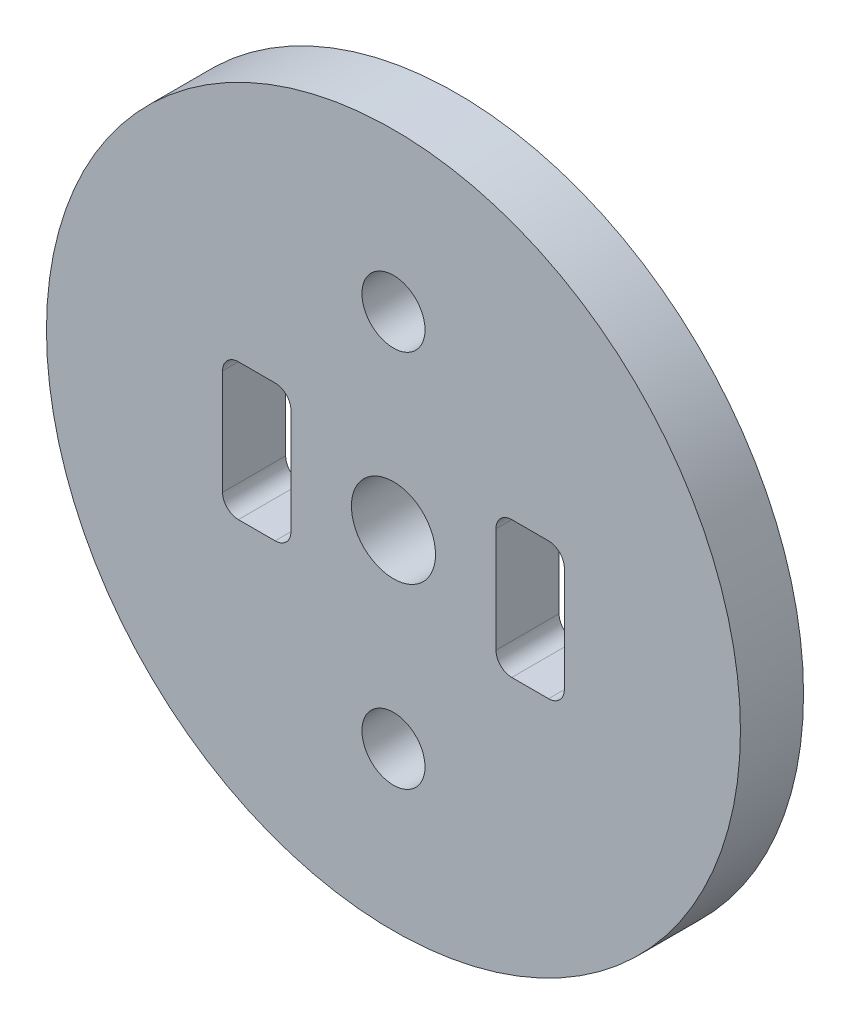
ISO-10303-21;
HEADER;
FILE_DESCRIPTION(('STEP AP214'),'2;1');
FILE_NAME('part.step','',(''),(''),'','','');
FILE_SCHEMA(('AUTOMOTIVE_DESIGN { 1 0 10303 214 1 1 1 1 }'));
ENDSEC;
DATA;
#1=APPLICATION_CONTEXT('core data for automotive mechanical design processes');
#2=APPLICATION_PROTOCOL_DEFINITION('international standard','automotive_design',2000,#1);
#3=PRODUCT_CONTEXT('',#1,'mechanical');
#4=PRODUCT('Part','Part','',(#3));
#5=PRODUCT_RELATED_PRODUCT_CATEGORY('part','',(#4));
#6=PRODUCT_DEFINITION_FORMATION('','',#4);
#7=PRODUCT_DEFINITION_CONTEXT('part definition',#1,'design');
#8=PRODUCT_DEFINITION('design','',#6,#7);
#9=PRODUCT_DEFINITION_SHAPE('','',#8);
#10=(LENGTH_UNIT() NAMED_UNIT(*) SI_UNIT(.MILLI.,.METRE.));
#11=(NAMED_UNIT(*) PLANE_ANGLE_UNIT() SI_UNIT($,.RADIAN.));
#12=(NAMED_UNIT(*) SI_UNIT($,.STERADIAN.) SOLID_ANGLE_UNIT());
#13=UNCERTAINTY_MEASURE_WITH_UNIT(LENGTH_MEASURE(1.E-05),#10,'distance_accuracy_value','');
#14=(GEOMETRIC_REPRESENTATION_CONTEXT(3) GLOBAL_UNCERTAINTY_ASSIGNED_CONTEXT((#13)) GLOBAL_UNIT_ASSIGNED_CONTEXT((#10,
#11,#12)) REPRESENTATION_CONTEXT('',''));
#15=CARTESIAN_POINT('',(0.,0.,0.));
#16=DIRECTION('',(0.,0.,1.));
#17=DIRECTION('',(1.,0.,0.));
#18=AXIS2_PLACEMENT_3D('',#15,#16,#17);
#19=CARTESIAN_POINT('',(215.7478079135,241.9520199932,3.));
#20=DIRECTION('',(0.,0.,1.));
#21=DIRECTION('',(1.,0.,0.));
#22=AXIS2_PLACEMENT_3D('',#19,#20,#21);
#23=PLANE('',#22);
#24=DIRECTION('',(0.,-1.,0.));
#25=VECTOR('',#24,1.);
#26=CARTESIAN_POINT('',(220.6228079135,244.4520199932,3.));
#27=LINE('',#26,#25);
#28=CARTESIAN_POINT('',(220.6228079135,244.4520199932,3.));
#29=VERTEX_POINT('',#28);
#30=CARTESIAN_POINT('',(220.6228079135,239.4520199932,3.));
#31=VERTEX_POINT('',#30);
#32=EDGE_CURVE('E213',#29,#31,#27,.T.);
#33=ORIENTED_EDGE('',*,*,#32,.F.);
#34=CARTESIAN_POINT('',(221.3728079135,244.4520199932,3.));
#35=DIRECTION('',(0.,0.,1.));
#36=DIRECTION('',(1.,0.,0.));
#37=AXIS2_PLACEMENT_3D('',#34,#35,#36);
#38=CIRCLE('',#37,0.750000000000001);
#39=CARTESIAN_POINT('',(221.3728079135,245.2020199932,3.));
#40=VERTEX_POINT('',#39);
#41=EDGE_CURVE('E211',#40,#29,#38,.T.);
#42=ORIENTED_EDGE('',*,*,#41,.F.);
#43=DIRECTION('',(-1.,0.,0.));
#44=VECTOR('',#43,1.);
#45=CARTESIAN_POINT('',(223.1228079135,245.2020199932,3.));
#46=LINE('',#45,#44);
#47=CARTESIAN_POINT('',(223.1228079135,245.2020199932,3.));
#48=VERTEX_POINT('',#47);
#49=EDGE_CURVE('E227',#48,#40,#46,.T.);
#50=ORIENTED_EDGE('',*,*,#49,.F.);
#51=CARTESIAN_POINT('',(223.1228079135,244.4520199932,3.));
#52=DIRECTION('',(0.,0.,1.));
#53=DIRECTION('',(1.,0.,0.));
#54=AXIS2_PLACEMENT_3D('',#51,#52,#53);
#55=CIRCLE('',#54,0.750000000000001);
#56=CARTESIAN_POINT('',(223.8728079135,244.4520199932,3.));
#57=VERTEX_POINT('',#56);
#58=EDGE_CURVE('E224',#57,#48,#55,.T.);
#59=ORIENTED_EDGE('',*,*,#58,.F.);
#60=DIRECTION('',(0.,1.,0.));
#61=VECTOR('',#60,1.);
#62=CARTESIAN_POINT('',(223.8728079135,239.4520199932,3.));
#63=LINE('',#62,#61);
#64=CARTESIAN_POINT('',(223.8728079135,239.4520199932,3.));
#65=VERTEX_POINT('',#64);
#66=EDGE_CURVE('E222',#65,#57,#63,.T.);
#67=ORIENTED_EDGE('',*,*,#66,.F.);
#68=CARTESIAN_POINT('',(223.1228079135,239.4520199932,3.));
#69=DIRECTION('',(0.,0.,1.));
#70=DIRECTION('',(1.,0.,0.));
#71=AXIS2_PLACEMENT_3D('',#68,#69,#70);
#72=CIRCLE('',#71,0.750000000000001);
#73=CARTESIAN_POINT('',(223.1228079135,238.7020199932,3.));
#74=VERTEX_POINT('',#73);
#75=EDGE_CURVE('E220',#74,#65,#72,.T.);
#76=ORIENTED_EDGE('',*,*,#75,.F.);
#77=DIRECTION('',(1.,0.,0.));
#78=VECTOR('',#77,1.);
#79=CARTESIAN_POINT('',(221.3728079135,238.7020199932,3.));
#80=LINE('',#79,#78);
#81=CARTESIAN_POINT('',(221.3728079135,238.7020199932,3.));
#82=VERTEX_POINT('',#81);
#83=EDGE_CURVE('E218',#82,#74,#80,.T.);
#84=ORIENTED_EDGE('',*,*,#83,.F.);
#85=CARTESIAN_POINT('',(221.3728079135,239.4520199932,3.));
#86=DIRECTION('',(0.,0.,1.));
#87=DIRECTION('',(1.,0.,0.));
#88=AXIS2_PLACEMENT_3D('',#85,#86,#87);
#89=CIRCLE('',#88,0.750000000000001);
#90=EDGE_CURVE('E216',#31,#82,#89,.T.);
#91=ORIENTED_EDGE('',*,*,#90,.F.);
#92=EDGE_LOOP('',(#33,#42,#50,#59,#67,#76,#84,#91));
#93=FACE_BOUND('',#92,.T.);
#94=CARTESIAN_POINT('',(215.7478079135,232.9520199932,3.));
#95=DIRECTION('',(0.,0.,1.));
#96=DIRECTION('',(1.,0.,0.));
#97=AXIS2_PLACEMENT_3D('',#94,#95,#96);
#98=CIRCLE('',#97,1.5);
#99=CARTESIAN_POINT('',(217.2478079135,232.9520199932,3.));
#100=VERTEX_POINT('',#99);
#101=EDGE_CURVE('E276',#100,#100,#98,.T.);
#102=ORIENTED_EDGE('',*,*,#101,.F.);
#103=EDGE_LOOP('',(#102));
#104=FACE_BOUND('',#103,.T.);
#105=CARTESIAN_POINT('',(215.7478079135,241.9520199932,3.));
#106=DIRECTION('',(0.,0.,1.));
#107=DIRECTION('',(1.,0.,0.));
#108=AXIS2_PLACEMENT_3D('',#105,#106,#107);
#109=CIRCLE('',#108,16.5);
#110=CARTESIAN_POINT('',(232.2478079135,241.9520199932,3.));
#111=VERTEX_POINT('',#110);
#112=EDGE_CURVE('E11',#111,#111,#109,.T.);
#113=ORIENTED_EDGE('',*,*,#112,.T.);
#114=EDGE_LOOP('',(#113));
#115=FACE_BOUND('',#114,.T.);
#116=CARTESIAN_POINT('',(215.7478079135,241.9520199932,3.));
#117=DIRECTION('',(0.,0.,1.));
#118=DIRECTION('',(1.,0.,0.));
#119=AXIS2_PLACEMENT_3D('',#116,#117,#118);
#120=CIRCLE('',#119,2.);
#121=CARTESIAN_POINT('',(217.7478079135,241.9520199932,3.));
#122=VERTEX_POINT('',#121);
#123=EDGE_CURVE('E282',#122,#122,#120,.T.);
#124=ORIENTED_EDGE('',*,*,#123,.F.);
#125=EDGE_LOOP('',(#124));
#126=FACE_BOUND('',#125,.T.);
#127=CARTESIAN_POINT('',(215.7478079135,250.9520199932,3.));
#128=DIRECTION('',(0.,0.,1.));
#129=DIRECTION('',(1.,0.,0.));
#130=AXIS2_PLACEMENT_3D('',#127,#128,#129);
#131=CIRCLE('',#130,1.5);
#132=CARTESIAN_POINT('',(217.2478079135,250.9520199932,3.));
#133=VERTEX_POINT('',#132);
#134=EDGE_CURVE('E270',#133,#133,#131,.T.);
#135=ORIENTED_EDGE('',*,*,#134,.F.);
#136=EDGE_LOOP('',(#135));
#137=FACE_BOUND('',#136,.T.);
#138=DIRECTION('',(-1.,0.,0.));
#139=VECTOR('',#138,1.);
#140=CARTESIAN_POINT('',(208.3728079135,245.2020199932,3.));
#141=LINE('',#140,#139);
#142=CARTESIAN_POINT('',(210.1228079135,245.2020199932,3.));
#143=VERTEX_POINT('',#142);
#144=CARTESIAN_POINT('',(208.3728079135,245.2020199932,3.));
#145=VERTEX_POINT('',#144);
#146=EDGE_CURVE('E154',#143,#145,#141,.T.);
#147=ORIENTED_EDGE('',*,*,#146,.F.);
#148=CARTESIAN_POINT('',(210.1228079135,244.4520199932,3.));
#149=DIRECTION('',(0.,0.,1.));
#150=DIRECTION('',(1.,0.,0.));
#151=AXIS2_PLACEMENT_3D('',#148,#149,#150);
#152=CIRCLE('',#151,0.750000000000001);
#153=CARTESIAN_POINT('',(210.8728079135,244.4520199932,3.));
#154=VERTEX_POINT('',#153);
#155=EDGE_CURVE('E146',#154,#143,#152,.T.);
#156=ORIENTED_EDGE('',*,*,#155,.F.);
#157=DIRECTION('',(0.,1.,0.));
#158=VECTOR('',#157,1.);
#159=CARTESIAN_POINT('',(210.8728079135,244.4520199932,3.));
#160=LINE('',#159,#158);
#161=CARTESIAN_POINT('',(210.8728079135,239.4520199932,3.));
#162=VERTEX_POINT('',#161);
#163=EDGE_CURVE('E179',#162,#154,#160,.T.);
#164=ORIENTED_EDGE('',*,*,#163,.F.);
#165=CARTESIAN_POINT('',(210.1228079135,239.4520199932,3.));
#166=DIRECTION('',(0.,0.,1.));
#167=DIRECTION('',(1.,0.,0.));
#168=AXIS2_PLACEMENT_3D('',#165,#166,#167);
#169=CIRCLE('',#168,0.750000000000001);
#170=CARTESIAN_POINT('',(210.1228079135,238.7020199932,3.));
#171=VERTEX_POINT('',#170);
#172=EDGE_CURVE('E177',#171,#162,#169,.T.);
#173=ORIENTED_EDGE('',*,*,#172,.F.);
#174=DIRECTION('',(1.,0.,0.));
#175=VECTOR('',#174,1.);
#176=CARTESIAN_POINT('',(210.1228079135,238.7020199932,3.));
#177=LINE('',#176,#175);
#178=CARTESIAN_POINT('',(208.3728079135,238.7020199932,3.));
#179=VERTEX_POINT('',#178);
#180=EDGE_CURVE('E175',#179,#171,#177,.T.);
#181=ORIENTED_EDGE('',*,*,#180,.F.);
#182=CARTESIAN_POINT('',(208.3728079135,239.4520199932,3.));
#183=DIRECTION('',(0.,0.,1.));
#184=DIRECTION('',(1.,0.,0.));
#185=AXIS2_PLACEMENT_3D('',#182,#183,#184);
#186=CIRCLE('',#185,0.750000000000237);
#187=CARTESIAN_POINT('',(207.6228079135,239.4520199932,3.));
#188=VERTEX_POINT('',#187);
#189=EDGE_CURVE('E173',#188,#179,#186,.T.);
#190=ORIENTED_EDGE('',*,*,#189,.F.);
#191=DIRECTION('',(0.,-1.,0.));
#192=VECTOR('',#191,1.);
#193=CARTESIAN_POINT('',(207.6228079135,239.4520199932,3.));
#194=LINE('',#193,#192);
#195=CARTESIAN_POINT('',(207.6228079135,244.4520199932,3.));
#196=VERTEX_POINT('',#195);
#197=EDGE_CURVE('E169',#196,#188,#194,.T.);
#198=ORIENTED_EDGE('',*,*,#197,.F.);
#199=CARTESIAN_POINT('',(208.3728079135,244.4520199932,3.));
#200=DIRECTION('',(0.,0.,1.));
#201=DIRECTION('',(1.,0.,0.));
#202=AXIS2_PLACEMENT_3D('',#199,#200,#201);
#203=CIRCLE('',#202,0.750000000000001);
#204=EDGE_CURVE('E167',#145,#196,#203,.T.);
#205=ORIENTED_EDGE('',*,*,#204,.F.);
#206=EDGE_LOOP('',(#147,#156,#164,#173,#181,#190,#198,#205));
#207=FACE_BOUND('',#206,.T.);
#208=ADVANCED_FACE('F33',(#93,#104,#115,#126,#137,#207),#23,.T.);
#209=CARTESIAN_POINT('',(215.7478079135,241.9520199932,0.));
#210=DIRECTION('',(0.,0.,1.));
#211=DIRECTION('',(1.,0.,0.));
#212=AXIS2_PLACEMENT_3D('',#209,#210,#211);
#213=PLANE('',#212);
#214=CARTESIAN_POINT('',(221.3728079135,244.4520199932,0.));
#215=DIRECTION('',(0.,0.,1.));
#216=DIRECTION('',(1.,0.,0.));
#217=AXIS2_PLACEMENT_3D('',#214,#215,#216);
#218=CIRCLE('',#217,0.750000000000001);
#219=CARTESIAN_POINT('',(221.3728079135,245.2020199932,0.));
#220=VERTEX_POINT('',#219);
#221=CARTESIAN_POINT('',(220.6228079135,244.4520199932,0.));
#222=VERTEX_POINT('',#221);
#223=EDGE_CURVE('E162',#220,#222,#218,.T.);
#224=ORIENTED_EDGE('',*,*,#223,.T.);
#225=DIRECTION('',(0.,-1.,0.));
#226=VECTOR('',#225,1.);
#227=CARTESIAN_POINT('',(220.6228079135,244.4520199932,0.));
#228=LINE('',#227,#226);
#229=CARTESIAN_POINT('',(220.6228079135,239.4520199932,0.));
#230=VERTEX_POINT('',#229);
#231=EDGE_CURVE('E232',#222,#230,#228,.T.);
#232=ORIENTED_EDGE('',*,*,#231,.T.);
#233=CARTESIAN_POINT('',(221.3728079135,239.4520199932,0.));
#234=DIRECTION('',(0.,0.,1.));
#235=DIRECTION('',(1.,0.,0.));
#236=AXIS2_PLACEMENT_3D('',#233,#234,#235);
#237=CIRCLE('',#236,0.750000000000001);
#238=CARTESIAN_POINT('',(221.3728079135,238.7020199932,0.));
#239=VERTEX_POINT('',#238);
#240=EDGE_CURVE('E235',#230,#239,#237,.T.);
#241=ORIENTED_EDGE('',*,*,#240,.T.);
#242=DIRECTION('',(1.,0.,0.));
#243=VECTOR('',#242,1.);
#244=CARTESIAN_POINT('',(221.3728079135,238.7020199932,0.));
#245=LINE('',#244,#243);
#246=CARTESIAN_POINT('',(223.1228079135,238.7020199932,0.));
#247=VERTEX_POINT('',#246);
#248=EDGE_CURVE('E238',#239,#247,#245,.T.);
#249=ORIENTED_EDGE('',*,*,#248,.T.);
#250=CARTESIAN_POINT('',(223.1228079135,239.4520199932,0.));
#251=DIRECTION('',(0.,0.,1.));
#252=DIRECTION('',(1.,0.,0.));
#253=AXIS2_PLACEMENT_3D('',#250,#251,#252);
#254=CIRCLE('',#253,0.750000000000001);
#255=CARTESIAN_POINT('',(223.8728079135,239.4520199932,0.));
#256=VERTEX_POINT('',#255);
#257=EDGE_CURVE('E241',#247,#256,#254,.T.);
#258=ORIENTED_EDGE('',*,*,#257,.T.);
#259=DIRECTION('',(0.,1.,0.));
#260=VECTOR('',#259,1.);
#261=CARTESIAN_POINT('',(223.8728079135,239.4520199932,0.));
#262=LINE('',#261,#260);
#263=CARTESIAN_POINT('',(223.8728079135,244.4520199932,0.));
#264=VERTEX_POINT('',#263);
#265=EDGE_CURVE('E244',#256,#264,#262,.T.);
#266=ORIENTED_EDGE('',*,*,#265,.T.);
#267=CARTESIAN_POINT('',(223.1228079135,244.4520199932,0.));
#268=DIRECTION('',(0.,0.,1.));
#269=DIRECTION('',(1.,0.,0.));
#270=AXIS2_PLACEMENT_3D('',#267,#268,#269);
#271=CIRCLE('',#270,0.750000000000001);
#272=CARTESIAN_POINT('',(223.1228079135,245.2020199932,0.));
#273=VERTEX_POINT('',#272);
#274=EDGE_CURVE('E247',#264,#273,#271,.T.);
#275=ORIENTED_EDGE('',*,*,#274,.T.);
#276=DIRECTION('',(-1.,0.,0.));
#277=VECTOR('',#276,1.);
#278=CARTESIAN_POINT('',(223.1228079135,245.2020199932,0.));
#279=LINE('',#278,#277);
#280=EDGE_CURVE('E214',#273,#220,#279,.T.);
#281=ORIENTED_EDGE('',*,*,#280,.T.);
#282=EDGE_LOOP('',(#224,#232,#241,#249,#258,#266,#275,#281));
#283=FACE_BOUND('',#282,.T.);
#284=CARTESIAN_POINT('',(215.7478079135,232.9520199932,0.));
#285=DIRECTION('',(0.,0.,1.));
#286=DIRECTION('',(1.,0.,0.));
#287=AXIS2_PLACEMENT_3D('',#284,#285,#286);
#288=CIRCLE('',#287,1.5);
#289=CARTESIAN_POINT('',(217.2478079135,232.9520199932,0.));
#290=VERTEX_POINT('',#289);
#291=EDGE_CURVE('E273',#290,#290,#288,.T.);
#292=ORIENTED_EDGE('',*,*,#291,.T.);
#293=EDGE_LOOP('',(#292));
#294=FACE_BOUND('',#293,.T.);
#295=CARTESIAN_POINT('',(215.7478079135,241.9520199932,0.));
#296=DIRECTION('',(0.,0.,1.));
#297=DIRECTION('',(1.,0.,0.));
#298=AXIS2_PLACEMENT_3D('',#295,#296,#297);
#299=CIRCLE('',#298,16.5);
#300=CARTESIAN_POINT('',(232.2478079135,241.9520199932,0.));
#301=VERTEX_POINT('',#300);
#302=EDGE_CURVE('E37',#301,#301,#299,.T.);
#303=ORIENTED_EDGE('',*,*,#302,.F.);
#304=EDGE_LOOP('',(#303));
#305=FACE_BOUND('',#304,.T.);
#306=CARTESIAN_POINT('',(215.7478079135,241.9520199932,0.));
#307=DIRECTION('',(0.,0.,1.));
#308=DIRECTION('',(1.,0.,0.));
#309=AXIS2_PLACEMENT_3D('',#306,#307,#308);
#310=CIRCLE('',#309,2.);
#311=CARTESIAN_POINT('',(217.7478079135,241.9520199932,0.));
#312=VERTEX_POINT('',#311);
#313=EDGE_CURVE('E279',#312,#312,#310,.T.);
#314=ORIENTED_EDGE('',*,*,#313,.T.);
#315=EDGE_LOOP('',(#314));
#316=FACE_BOUND('',#315,.T.);
#317=CARTESIAN_POINT('',(215.7478079135,250.9520199932,0.));
#318=DIRECTION('',(0.,0.,1.));
#319=DIRECTION('',(1.,0.,0.));
#320=AXIS2_PLACEMENT_3D('',#317,#318,#319);
#321=CIRCLE('',#320,1.5);
#322=CARTESIAN_POINT('',(217.2478079135,250.9520199932,0.));
#323=VERTEX_POINT('',#322);
#324=EDGE_CURVE('E269',#323,#323,#321,.T.);
#325=ORIENTED_EDGE('',*,*,#324,.T.);
#326=EDGE_LOOP('',(#325));
#327=FACE_BOUND('',#326,.T.);
#328=CARTESIAN_POINT('',(210.1228079135,244.4520199932,0.));
#329=DIRECTION('',(0.,0.,1.));
#330=DIRECTION('',(1.,0.,0.));
#331=AXIS2_PLACEMENT_3D('',#328,#329,#330);
#332=CIRCLE('',#331,0.750000000000001);
#333=CARTESIAN_POINT('',(210.8728079135,244.4520199932,0.));
#334=VERTEX_POINT('',#333);
#335=CARTESIAN_POINT('',(210.1228079135,245.2020199932,0.));
#336=VERTEX_POINT('',#335);
#337=EDGE_CURVE('E56',#334,#336,#332,.T.);
#338=ORIENTED_EDGE('',*,*,#337,.T.);
#339=DIRECTION('',(-1.,0.,0.));
#340=VECTOR('',#339,1.);
#341=CARTESIAN_POINT('',(208.3728079135,245.2020199932,0.));
#342=LINE('',#341,#340);
#343=CARTESIAN_POINT('',(208.3728079135,245.2020199932,0.));
#344=VERTEX_POINT('',#343);
#345=EDGE_CURVE('E161',#336,#344,#342,.T.);
#346=ORIENTED_EDGE('',*,*,#345,.T.);
#347=CARTESIAN_POINT('',(208.3728079135,244.4520199932,0.));
#348=DIRECTION('',(0.,0.,1.));
#349=DIRECTION('',(1.,0.,0.));
#350=AXIS2_PLACEMENT_3D('',#347,#348,#349);
#351=CIRCLE('',#350,0.750000000000001);
#352=CARTESIAN_POINT('',(207.6228079135,244.4520199932,0.));
#353=VERTEX_POINT('',#352);
#354=EDGE_CURVE('E183',#344,#353,#351,.T.);
#355=ORIENTED_EDGE('',*,*,#354,.T.);
#356=DIRECTION('',(0.,-1.,0.));
#357=VECTOR('',#356,1.);
#358=CARTESIAN_POINT('',(207.6228079135,239.4520199932,0.));
#359=LINE('',#358,#357);
#360=CARTESIAN_POINT('',(207.6228079135,239.4520199932,0.));
#361=VERTEX_POINT('',#360);
#362=EDGE_CURVE('E186',#353,#361,#359,.T.);
#363=ORIENTED_EDGE('',*,*,#362,.T.);
#364=CARTESIAN_POINT('',(208.3728079135,239.4520199932,0.));
#365=DIRECTION('',(0.,0.,1.));
#366=DIRECTION('',(1.,0.,0.));
#367=AXIS2_PLACEMENT_3D('',#364,#365,#366);
#368=CIRCLE('',#367,0.750000000000237);
#369=CARTESIAN_POINT('',(208.3728079135,238.7020199932,0.));
#370=VERTEX_POINT('',#369);
#371=EDGE_CURVE('E189',#361,#370,#368,.T.);
#372=ORIENTED_EDGE('',*,*,#371,.T.);
#373=DIRECTION('',(1.,0.,0.));
#374=VECTOR('',#373,1.);
#375=CARTESIAN_POINT('',(210.1228079135,238.7020199932,0.));
#376=LINE('',#375,#374);
#377=CARTESIAN_POINT('',(210.1228079135,238.7020199932,0.));
#378=VERTEX_POINT('',#377);
#379=EDGE_CURVE('E192',#370,#378,#376,.T.);
#380=ORIENTED_EDGE('',*,*,#379,.T.);
#381=CARTESIAN_POINT('',(210.1228079135,239.4520199932,0.));
#382=DIRECTION('',(0.,0.,1.));
#383=DIRECTION('',(1.,0.,0.));
#384=AXIS2_PLACEMENT_3D('',#381,#382,#383);
#385=CIRCLE('',#384,0.750000000000001);
#386=CARTESIAN_POINT('',(210.8728079135,239.4520199932,0.));
#387=VERTEX_POINT('',#386);
#388=EDGE_CURVE('E195',#378,#387,#385,.T.);
#389=ORIENTED_EDGE('',*,*,#388,.T.);
#390=DIRECTION('',(0.,1.,0.));
#391=VECTOR('',#390,1.);
#392=CARTESIAN_POINT('',(210.8728079135,244.4520199932,0.));
#393=LINE('',#392,#391);
#394=EDGE_CURVE('E155',#387,#334,#393,.T.);
#395=ORIENTED_EDGE('',*,*,#394,.T.);
#396=EDGE_LOOP('',(#338,#346,#355,#363,#372,#380,#389,#395));
#397=FACE_BOUND('',#396,.T.);
#398=ADVANCED_FACE('F288',(#283,#294,#305,#316,#327,#397),#213,.F.);
#399=CARTESIAN_POINT('',(215.7478079135,241.9520199932,3.));
#400=DIRECTION('',(0.,0.,-1.));
#401=DIRECTION('',(-1.,0.,0.));
#402=AXIS2_PLACEMENT_3D('',#399,#400,#401);
#403=CYLINDRICAL_SURFACE('',#402,16.5);
#404=ORIENTED_EDGE('',*,*,#112,.F.);
#405=EDGE_LOOP('',(#404));
#406=FACE_BOUND('',#405,.T.);
#407=ORIENTED_EDGE('',*,*,#302,.T.);
#408=EDGE_LOOP('',(#407));
#409=FACE_BOUND('',#408,.T.);
#410=ADVANCED_FACE('F35',(#406,#409),#403,.T.);
#411=CARTESIAN_POINT('',(215.7478079135,241.9520199932,3.));
#412=DIRECTION('',(0.,0.,-1.));
#413=DIRECTION('',(-1.,0.,0.));
#414=AXIS2_PLACEMENT_3D('',#411,#412,#413);
#415=CYLINDRICAL_SURFACE('',#414,2.);
#416=ORIENTED_EDGE('',*,*,#123,.T.);
#417=EDGE_LOOP('',(#416));
#418=FACE_BOUND('',#417,.T.);
#419=ORIENTED_EDGE('',*,*,#313,.F.);
#420=EDGE_LOOP('',(#419));
#421=FACE_BOUND('',#420,.T.);
#422=ADVANCED_FACE('F291',(#418,#421),#415,.F.);
#423=CARTESIAN_POINT('',(215.7478079135,232.9520199932,3.));
#424=DIRECTION('',(0.,0.,-1.));
#425=DIRECTION('',(-1.,0.,0.));
#426=AXIS2_PLACEMENT_3D('',#423,#424,#425);
#427=CYLINDRICAL_SURFACE('',#426,1.5);
#428=ORIENTED_EDGE('',*,*,#101,.T.);
#429=EDGE_LOOP('',(#428));
#430=FACE_BOUND('',#429,.T.);
#431=ORIENTED_EDGE('',*,*,#291,.F.);
#432=EDGE_LOOP('',(#431));
#433=FACE_BOUND('',#432,.T.);
#434=ADVANCED_FACE('F293',(#430,#433),#427,.F.);
#435=CARTESIAN_POINT('',(215.7478079135,250.9520199932,3.));
#436=DIRECTION('',(0.,0.,-1.));
#437=DIRECTION('',(-1.,0.,0.));
#438=AXIS2_PLACEMENT_3D('',#435,#436,#437);
#439=CYLINDRICAL_SURFACE('',#438,1.5);
#440=ORIENTED_EDGE('',*,*,#134,.T.);
#441=EDGE_LOOP('',(#440));
#442=FACE_BOUND('',#441,.T.);
#443=ORIENTED_EDGE('',*,*,#324,.F.);
#444=EDGE_LOOP('',(#443));
#445=FACE_BOUND('',#444,.T.);
#446=ADVANCED_FACE('F300',(#442,#445),#439,.F.);
#447=CARTESIAN_POINT('',(221.3728079135,244.4520199932,3.));
#448=DIRECTION('',(0.,0.,-1.));
#449=DIRECTION('',(-1.,0.,0.));
#450=AXIS2_PLACEMENT_3D('',#447,#448,#449);
#451=CYLINDRICAL_SURFACE('',#450,0.750000000000001);
#452=ORIENTED_EDGE('',*,*,#223,.F.);
#453=DIRECTION('',(0.,0.,-1.));
#454=VECTOR('',#453,1.);
#455=CARTESIAN_POINT('',(221.3728079135,245.2020199932,3.));
#456=LINE('',#455,#454);
#457=EDGE_CURVE('E229',#40,#220,#456,.T.);
#458=ORIENTED_EDGE('',*,*,#457,.F.);
#459=ORIENTED_EDGE('',*,*,#41,.T.);
#460=DIRECTION('',(0.,0.,-1.));
#461=VECTOR('',#460,1.);
#462=CARTESIAN_POINT('',(220.6228079135,244.4520199932,3.));
#463=LINE('',#462,#461);
#464=EDGE_CURVE('E266',#29,#222,#463,.T.);
#465=ORIENTED_EDGE('',*,*,#464,.T.);
#466=EDGE_LOOP('',(#452,#458,#459,#465));
#467=FACE_BOUND('',#466,.T.);
#468=ADVANCED_FACE('F325',(#467),#451,.F.);
#469=CARTESIAN_POINT('',(220.6228079135,244.4520199932,3.));
#470=DIRECTION('',(1.,0.,0.));
#471=DIRECTION('',(0.,0.,-1.));
#472=AXIS2_PLACEMENT_3D('',#469,#470,#471);
#473=PLANE('',#472);
#474=ORIENTED_EDGE('',*,*,#231,.F.);
#475=ORIENTED_EDGE('',*,*,#464,.F.);
#476=ORIENTED_EDGE('',*,*,#32,.T.);
#477=DIRECTION('',(0.,0.,-1.));
#478=VECTOR('',#477,1.);
#479=CARTESIAN_POINT('',(220.6228079135,239.4520199932,3.));
#480=LINE('',#479,#478);
#481=EDGE_CURVE('E264',#31,#230,#480,.T.);
#482=ORIENTED_EDGE('',*,*,#481,.T.);
#483=EDGE_LOOP('',(#474,#475,#476,#482));
#484=FACE_BOUND('',#483,.T.);
#485=ADVANCED_FACE('F387',(#484),#473,.T.);
#486=CARTESIAN_POINT('',(221.3728079135,239.4520199932,3.));
#487=DIRECTION('',(0.,0.,-1.));
#488=DIRECTION('',(-1.,0.,0.));
#489=AXIS2_PLACEMENT_3D('',#486,#487,#488);
#490=CYLINDRICAL_SURFACE('',#489,0.750000000000001);
#491=ORIENTED_EDGE('',*,*,#240,.F.);
#492=ORIENTED_EDGE('',*,*,#481,.F.);
#493=ORIENTED_EDGE('',*,*,#90,.T.);
#494=DIRECTION('',(0.,0.,-1.));
#495=VECTOR('',#494,1.);
#496=CARTESIAN_POINT('',(221.3728079135,238.7020199932,3.));
#497=LINE('',#496,#495);
#498=EDGE_CURVE('E262',#82,#239,#497,.T.);
#499=ORIENTED_EDGE('',*,*,#498,.T.);
#500=EDGE_LOOP('',(#491,#492,#493,#499));
#501=FACE_BOUND('',#500,.T.);
#502=ADVANCED_FACE('F383',(#501),#490,.F.);
#503=CARTESIAN_POINT('',(221.3728079135,238.7020199932,3.));
#504=DIRECTION('',(0.,1.,0.));
#505=DIRECTION('',(0.,0.,1.));
#506=AXIS2_PLACEMENT_3D('',#503,#504,#505);
#507=PLANE('',#506);
#508=ORIENTED_EDGE('',*,*,#248,.F.);
#509=ORIENTED_EDGE('',*,*,#498,.F.);
#510=ORIENTED_EDGE('',*,*,#83,.T.);
#511=DIRECTION('',(0.,0.,-1.));
#512=VECTOR('',#511,1.);
#513=CARTESIAN_POINT('',(223.1228079135,238.7020199932,3.));
#514=LINE('',#513,#512);
#515=EDGE_CURVE('E260',#74,#247,#514,.T.);
#516=ORIENTED_EDGE('',*,*,#515,.T.);
#517=EDGE_LOOP('',(#508,#509,#510,#516));
#518=FACE_BOUND('',#517,.T.);
#519=ADVANCED_FACE('F379',(#518),#507,.T.);
#520=CARTESIAN_POINT('',(223.1228079135,239.4520199932,3.));
#521=DIRECTION('',(0.,0.,-1.));
#522=DIRECTION('',(-1.,0.,0.));
#523=AXIS2_PLACEMENT_3D('',#520,#521,#522);
#524=CYLINDRICAL_SURFACE('',#523,0.750000000000001);
#525=ORIENTED_EDGE('',*,*,#257,.F.);
#526=ORIENTED_EDGE('',*,*,#515,.F.);
#527=ORIENTED_EDGE('',*,*,#75,.T.);
#528=DIRECTION('',(0.,0.,-1.));
#529=VECTOR('',#528,1.);
#530=CARTESIAN_POINT('',(223.8728079135,239.4520199932,3.));
#531=LINE('',#530,#529);
#532=EDGE_CURVE('E258',#65,#256,#531,.T.);
#533=ORIENTED_EDGE('',*,*,#532,.T.);
#534=EDGE_LOOP('',(#525,#526,#527,#533));
#535=FACE_BOUND('',#534,.T.);
#536=ADVANCED_FACE('F375',(#535),#524,.F.);
#537=CARTESIAN_POINT('',(223.8728079135,239.4520199932,3.));
#538=DIRECTION('',(-1.,0.,0.));
#539=DIRECTION('',(0.,0.,1.));
#540=AXIS2_PLACEMENT_3D('',#537,#538,#539);
#541=PLANE('',#540);
#542=ORIENTED_EDGE('',*,*,#265,.F.);
#543=ORIENTED_EDGE('',*,*,#532,.F.);
#544=ORIENTED_EDGE('',*,*,#66,.T.);
#545=DIRECTION('',(0.,0.,-1.));
#546=VECTOR('',#545,1.);
#547=CARTESIAN_POINT('',(223.8728079135,244.4520199932,3.));
#548=LINE('',#547,#546);
#549=EDGE_CURVE('E256',#57,#264,#548,.T.);
#550=ORIENTED_EDGE('',*,*,#549,.T.);
#551=EDGE_LOOP('',(#542,#543,#544,#550));
#552=FACE_BOUND('',#551,.T.);
#553=ADVANCED_FACE('F371',(#552),#541,.T.);
#554=CARTESIAN_POINT('',(223.1228079135,244.4520199932,3.));
#555=DIRECTION('',(0.,0.,-1.));
#556=DIRECTION('',(-1.,0.,0.));
#557=AXIS2_PLACEMENT_3D('',#554,#555,#556);
#558=CYLINDRICAL_SURFACE('',#557,0.750000000000001);
#559=ORIENTED_EDGE('',*,*,#274,.F.);
#560=ORIENTED_EDGE('',*,*,#549,.F.);
#561=ORIENTED_EDGE('',*,*,#58,.T.);
#562=DIRECTION('',(0.,0.,-1.));
#563=VECTOR('',#562,1.);
#564=CARTESIAN_POINT('',(223.1228079135,245.2020199932,3.));
#565=LINE('',#564,#563);
#566=EDGE_CURVE('E254',#48,#273,#565,.T.);
#567=ORIENTED_EDGE('',*,*,#566,.T.);
#568=EDGE_LOOP('',(#559,#560,#561,#567));
#569=FACE_BOUND('',#568,.T.);
#570=ADVANCED_FACE('F367',(#569),#558,.F.);
#571=CARTESIAN_POINT('',(223.1228079135,245.2020199932,3.));
#572=DIRECTION('',(0.,-1.,0.));
#573=DIRECTION('',(0.,0.,-1.));
#574=AXIS2_PLACEMENT_3D('',#571,#572,#573);
#575=PLANE('',#574);
#576=ORIENTED_EDGE('',*,*,#280,.F.);
#577=ORIENTED_EDGE('',*,*,#566,.F.);
#578=ORIENTED_EDGE('',*,*,#49,.T.);
#579=ORIENTED_EDGE('',*,*,#457,.T.);
#580=EDGE_LOOP('',(#576,#577,#578,#579));
#581=FACE_BOUND('',#580,.T.);
#582=ADVANCED_FACE('F364',(#581),#575,.T.);
#583=CARTESIAN_POINT('',(210.1228079135,244.4520199932,3.));
#584=DIRECTION('',(0.,0.,-1.));
#585=DIRECTION('',(-1.,0.,0.));
#586=AXIS2_PLACEMENT_3D('',#583,#584,#585);
#587=CYLINDRICAL_SURFACE('',#586,0.750000000000001);
#588=ORIENTED_EDGE('',*,*,#337,.F.);
#589=DIRECTION('',(0.,0.,-1.));
#590=VECTOR('',#589,1.);
#591=CARTESIAN_POINT('',(210.8728079135,244.4520199932,3.));
#592=LINE('',#591,#590);
#593=EDGE_CURVE('E150',#154,#334,#592,.T.);
#594=ORIENTED_EDGE('',*,*,#593,.F.);
#595=ORIENTED_EDGE('',*,*,#155,.T.);
#596=DIRECTION('',(0.,0.,-1.));
#597=VECTOR('',#596,1.);
#598=CARTESIAN_POINT('',(210.1228079135,245.2020199932,3.));
#599=LINE('',#598,#597);
#600=EDGE_CURVE('E149',#143,#336,#599,.T.);
#601=ORIENTED_EDGE('',*,*,#600,.T.);
#602=EDGE_LOOP('',(#588,#594,#595,#601));
#603=FACE_BOUND('',#602,.T.);
#604=ADVANCED_FACE('F148',(#603),#587,.F.);
#605=CARTESIAN_POINT('',(208.3728079135,245.2020199932,3.));
#606=DIRECTION('',(0.,-1.,0.));
#607=DIRECTION('',(0.,0.,-1.));
#608=AXIS2_PLACEMENT_3D('',#605,#606,#607);
#609=PLANE('',#608);
#610=ORIENTED_EDGE('',*,*,#345,.F.);
#611=ORIENTED_EDGE('',*,*,#600,.F.);
#612=ORIENTED_EDGE('',*,*,#146,.T.);
#613=DIRECTION('',(0.,0.,-1.));
#614=VECTOR('',#613,1.);
#615=CARTESIAN_POINT('',(208.3728079135,245.2020199932,3.));
#616=LINE('',#615,#614);
#617=EDGE_CURVE('E163',#145,#344,#616,.T.);
#618=ORIENTED_EDGE('',*,*,#617,.T.);
#619=EDGE_LOOP('',(#610,#611,#612,#618));
#620=FACE_BOUND('',#619,.T.);
#621=ADVANCED_FACE('F158',(#620),#609,.T.);
#622=CARTESIAN_POINT('',(208.3728079135,244.4520199932,3.));
#623=DIRECTION('',(0.,0.,-1.));
#624=DIRECTION('',(-1.,0.,0.));
#625=AXIS2_PLACEMENT_3D('',#622,#623,#624);
#626=CYLINDRICAL_SURFACE('',#625,0.750000000000001);
#627=ORIENTED_EDGE('',*,*,#354,.F.);
#628=ORIENTED_EDGE('',*,*,#617,.F.);
#629=ORIENTED_EDGE('',*,*,#204,.T.);
#630=DIRECTION('',(0.,0.,-1.));
#631=VECTOR('',#630,1.);
#632=CARTESIAN_POINT('',(207.6228079135,244.4520199932,3.));
#633=LINE('',#632,#631);
#634=EDGE_CURVE('E208',#196,#353,#633,.T.);
#635=ORIENTED_EDGE('',*,*,#634,.T.);
#636=EDGE_LOOP('',(#627,#628,#629,#635));
#637=FACE_BOUND('',#636,.T.);
#638=ADVANCED_FACE('F351',(#637),#626,.F.);
#639=CARTESIAN_POINT('',(207.6228079135,239.4520199932,3.));
#640=DIRECTION('',(1.,0.,0.));
#641=DIRECTION('',(0.,0.,-1.));
#642=AXIS2_PLACEMENT_3D('',#639,#640,#641);
#643=PLANE('',#642);
#644=ORIENTED_EDGE('',*,*,#362,.F.);
#645=ORIENTED_EDGE('',*,*,#634,.F.);
#646=ORIENTED_EDGE('',*,*,#197,.T.);
#647=DIRECTION('',(0.,0.,-1.));
#648=VECTOR('',#647,1.);
#649=CARTESIAN_POINT('',(207.6228079135,239.4520199932,3.));
#650=LINE('',#649,#648);
#651=EDGE_CURVE('E206',#188,#361,#650,.T.);
#652=ORIENTED_EDGE('',*,*,#651,.T.);
#653=EDGE_LOOP('',(#644,#645,#646,#652));
#654=FACE_BOUND('',#653,.T.);
#655=ADVANCED_FACE('F348',(#654),#643,.T.);
#656=CARTESIAN_POINT('',(208.3728079135,239.4520199932,3.));
#657=DIRECTION('',(0.,0.,-1.));
#658=DIRECTION('',(-1.,0.,0.));
#659=AXIS2_PLACEMENT_3D('',#656,#657,#658);
#660=CYLINDRICAL_SURFACE('',#659,0.750000000000237);
#661=ORIENTED_EDGE('',*,*,#371,.F.);
#662=ORIENTED_EDGE('',*,*,#651,.F.);
#663=ORIENTED_EDGE('',*,*,#189,.T.);
#664=DIRECTION('',(0.,0.,-1.));
#665=VECTOR('',#664,1.);
#666=CARTESIAN_POINT('',(208.3728079135,238.7020199932,3.));
#667=LINE('',#666,#665);
#668=EDGE_CURVE('E204',#179,#370,#667,.T.);
#669=ORIENTED_EDGE('',*,*,#668,.T.);
#670=EDGE_LOOP('',(#661,#662,#663,#669));
#671=FACE_BOUND('',#670,.T.);
#672=ADVANCED_FACE('F343',(#671),#660,.F.);
#673=CARTESIAN_POINT('',(210.1228079135,238.7020199932,3.));
#674=DIRECTION('',(0.,1.,0.));
#675=DIRECTION('',(0.,0.,1.));
#676=AXIS2_PLACEMENT_3D('',#673,#674,#675);
#677=PLANE('',#676);
#678=ORIENTED_EDGE('',*,*,#379,.F.);
#679=ORIENTED_EDGE('',*,*,#668,.F.);
#680=ORIENTED_EDGE('',*,*,#180,.T.);
#681=DIRECTION('',(0.,0.,-1.));
#682=VECTOR('',#681,1.);
#683=CARTESIAN_POINT('',(210.1228079135,238.7020199932,3.));
#684=LINE('',#683,#682);
#685=EDGE_CURVE('E202',#171,#378,#684,.T.);
#686=ORIENTED_EDGE('',*,*,#685,.T.);
#687=EDGE_LOOP('',(#678,#679,#680,#686));
#688=FACE_BOUND('',#687,.T.);
#689=ADVANCED_FACE('F339',(#688),#677,.T.);
#690=CARTESIAN_POINT('',(210.1228079135,239.4520199932,3.));
#691=DIRECTION('',(0.,0.,-1.));
#692=DIRECTION('',(-1.,0.,0.));
#693=AXIS2_PLACEMENT_3D('',#690,#691,#692);
#694=CYLINDRICAL_SURFACE('',#693,0.750000000000001);
#695=ORIENTED_EDGE('',*,*,#388,.F.);
#696=ORIENTED_EDGE('',*,*,#685,.F.);
#697=ORIENTED_EDGE('',*,*,#172,.T.);
#698=DIRECTION('',(0.,0.,-1.));
#699=VECTOR('',#698,1.);
#700=CARTESIAN_POINT('',(210.8728079135,239.4520199932,3.));
#701=LINE('',#700,#699);
#702=EDGE_CURVE('E48',#162,#387,#701,.T.);
#703=ORIENTED_EDGE('',*,*,#702,.T.);
#704=EDGE_LOOP('',(#695,#696,#697,#703));
#705=FACE_BOUND('',#704,.T.);
#706=ADVANCED_FACE('F336',(#705),#694,.F.);
#707=CARTESIAN_POINT('',(210.8728079135,244.4520199932,3.));
#708=DIRECTION('',(-1.,0.,0.));
#709=DIRECTION('',(0.,0.,1.));
#710=AXIS2_PLACEMENT_3D('',#707,#708,#709);
#711=PLANE('',#710);
#712=ORIENTED_EDGE('',*,*,#394,.F.);
#713=ORIENTED_EDGE('',*,*,#702,.F.);
#714=ORIENTED_EDGE('',*,*,#163,.T.);
#715=ORIENTED_EDGE('',*,*,#593,.T.);
#716=EDGE_LOOP('',(#712,#713,#714,#715));
#717=FACE_BOUND('',#716,.T.);
#718=ADVANCED_FACE('F330',(#717),#711,.T.);
#719=CLOSED_SHELL('',(#208,#398,#410,#422,#434,#446,#468,#485,#502,#519,#536,#553,#570,#582,
#604,#621,#638,#655,#672,#689,#706,#718));
#720=MANIFOLD_SOLID_BREP('B2',#719);
#721=ADVANCED_BREP_SHAPE_REPRESENTATION('',(#18,#720),#14);
#722=SHAPE_DEFINITION_REPRESENTATION(#9,#721);
ENDSEC;
END-ISO-10303-21;
